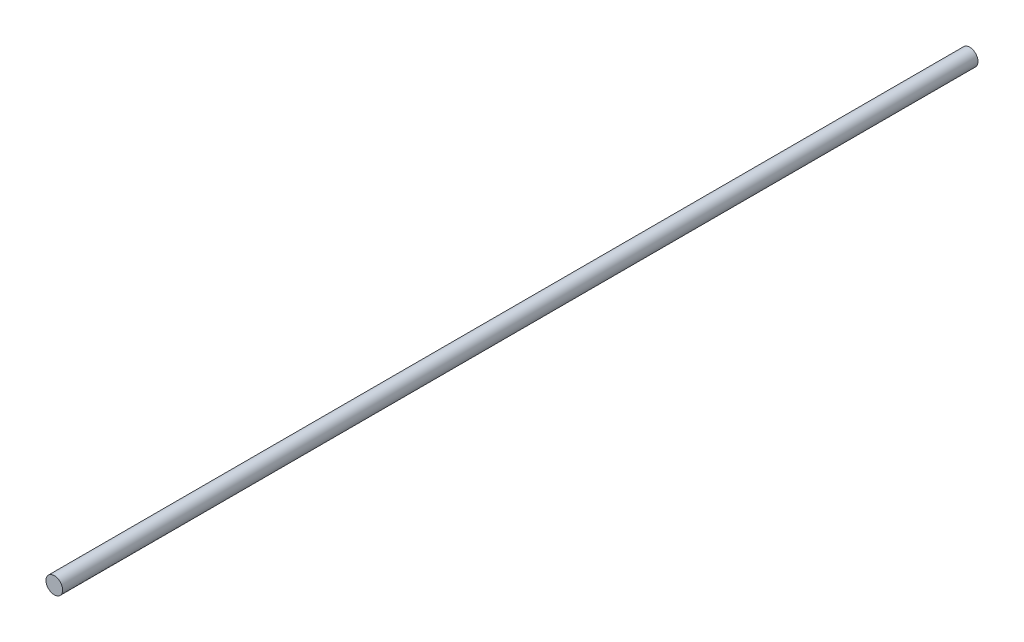
ISO-10303-21;
HEADER;
FILE_DESCRIPTION(('STEP AP214'),'2;1');
FILE_NAME('part.step','',(''),(''),'','','');
FILE_SCHEMA(('AUTOMOTIVE_DESIGN { 1 0 10303 214 1 1 1 1 }'));
ENDSEC;
DATA;
#1=APPLICATION_CONTEXT('core data for automotive mechanical design processes');
#2=APPLICATION_PROTOCOL_DEFINITION('international standard','automotive_design',2000,#1);
#3=PRODUCT_CONTEXT('',#1,'mechanical');
#4=PRODUCT('Part','Part','',(#3));
#5=PRODUCT_RELATED_PRODUCT_CATEGORY('part','',(#4));
#6=PRODUCT_DEFINITION_FORMATION('','',#4);
#7=PRODUCT_DEFINITION_CONTEXT('part definition',#1,'design');
#8=PRODUCT_DEFINITION('design','',#6,#7);
#9=PRODUCT_DEFINITION_SHAPE('','',#8);
#10=(LENGTH_UNIT() NAMED_UNIT(*) SI_UNIT(.MILLI.,.METRE.));
#11=(NAMED_UNIT(*) PLANE_ANGLE_UNIT() SI_UNIT($,.RADIAN.));
#12=(NAMED_UNIT(*) SI_UNIT($,.STERADIAN.) SOLID_ANGLE_UNIT());
#13=UNCERTAINTY_MEASURE_WITH_UNIT(LENGTH_MEASURE(1.E-05),#10,'distance_accuracy_value','');
#14=(GEOMETRIC_REPRESENTATION_CONTEXT(3) GLOBAL_UNCERTAINTY_ASSIGNED_CONTEXT((#13)) GLOBAL_UNIT_ASSIGNED_CONTEXT((#10,
#11,#12)) REPRESENTATION_CONTEXT('',''));
#15=CARTESIAN_POINT('',(0.,0.,0.));
#16=DIRECTION('',(0.,0.,1.));
#17=DIRECTION('',(1.,0.,0.));
#18=AXIS2_PLACEMENT_3D('',#15,#16,#17);
#19=CARTESIAN_POINT('',(0.,0.,550.));
#20=DIRECTION('',(0.,0.,-1.));
#21=DIRECTION('',(-1.,0.,0.));
#22=AXIS2_PLACEMENT_3D('',#19,#20,#21);
#23=CYLINDRICAL_SURFACE('',#22,5.);
#24=CARTESIAN_POINT('',(0.,0.,550.));
#25=DIRECTION('',(0.,0.,1.));
#26=DIRECTION('',(1.,0.,0.));
#27=AXIS2_PLACEMENT_3D('',#24,#25,#26);
#28=CIRCLE('',#27,5.);
#29=CARTESIAN_POINT('',(5.,0.,550.));
#30=VERTEX_POINT('',#29);
#31=EDGE_CURVE('E10',#30,#30,#28,.T.);
#32=ORIENTED_EDGE('',*,*,#31,.F.);
#33=EDGE_LOOP('',(#32));
#34=FACE_BOUND('',#33,.T.);
#35=CARTESIAN_POINT('',(0.,0.,0.));
#36=DIRECTION('',(0.,0.,1.));
#37=DIRECTION('',(1.,0.,0.));
#38=AXIS2_PLACEMENT_3D('',#35,#36,#37);
#39=CIRCLE('',#38,5.);
#40=CARTESIAN_POINT('',(5.,0.,0.));
#41=VERTEX_POINT('',#40);
#42=EDGE_CURVE('E36',#41,#41,#39,.T.);
#43=ORIENTED_EDGE('',*,*,#42,.T.);
#44=EDGE_LOOP('',(#43));
#45=FACE_BOUND('',#44,.T.);
#46=ADVANCED_FACE('F33',(#34,#45),#23,.T.);
#47=CARTESIAN_POINT('',(0.,0.,550.));
#48=DIRECTION('',(0.,0.,1.));
#49=DIRECTION('',(1.,0.,0.));
#50=AXIS2_PLACEMENT_3D('',#47,#48,#49);
#51=PLANE('',#50);
#52=ORIENTED_EDGE('',*,*,#31,.T.);
#53=EDGE_LOOP('',(#52));
#54=FACE_BOUND('',#53,.T.);
#55=ADVANCED_FACE('F48',(#54),#51,.T.);
#56=CARTESIAN_POINT('',(0.,0.,0.));
#57=DIRECTION('',(0.,0.,1.));
#58=DIRECTION('',(1.,0.,0.));
#59=AXIS2_PLACEMENT_3D('',#56,#57,#58);
#60=PLANE('',#59);
#61=ORIENTED_EDGE('',*,*,#42,.F.);
#62=EDGE_LOOP('',(#61));
#63=FACE_BOUND('',#62,.T.);
#64=ADVANCED_FACE('F46',(#63),#60,.F.);
#65=CLOSED_SHELL('',(#46,#55,#64));
#66=MANIFOLD_SOLID_BREP('B2',#65);
#67=ADVANCED_BREP_SHAPE_REPRESENTATION('',(#18,#66),#14);
#68=SHAPE_DEFINITION_REPRESENTATION(#9,#67);
ENDSEC;
END-ISO-10303-21;
